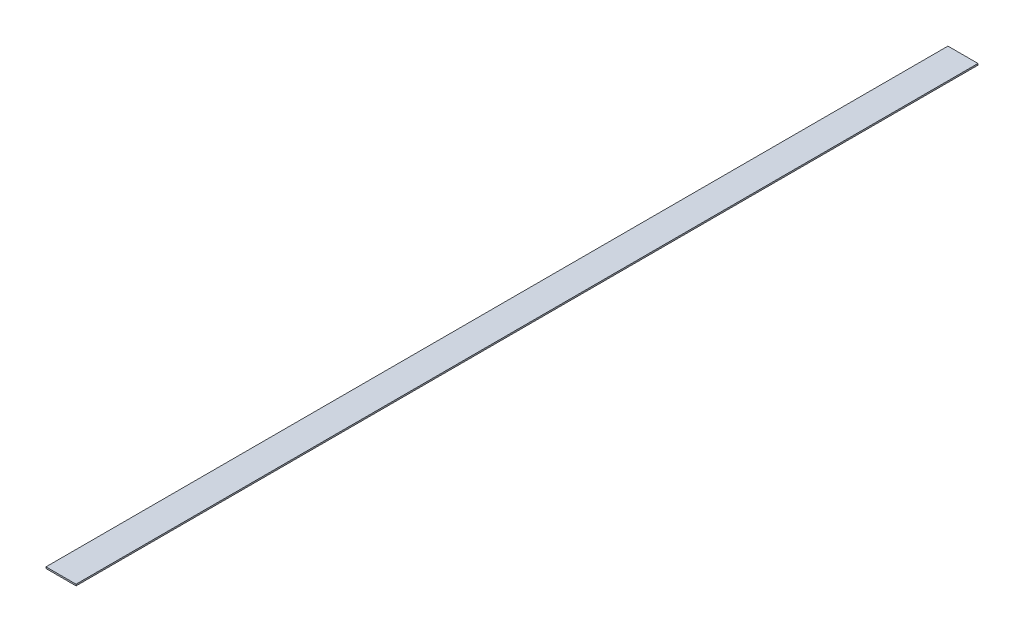
ISO-10303-21;
HEADER;
FILE_DESCRIPTION(('STEP AP214'),'2;1');
FILE_NAME('part.step','',(''),(''),'','','');
FILE_SCHEMA(('AUTOMOTIVE_DESIGN { 1 0 10303 214 1 1 1 1 }'));
ENDSEC;
DATA;
#1=APPLICATION_CONTEXT('core data for automotive mechanical design processes');
#2=APPLICATION_PROTOCOL_DEFINITION('international standard','automotive_design',2000,#1);
#3=PRODUCT_CONTEXT('',#1,'mechanical');
#4=PRODUCT('Part','Part','',(#3));
#5=PRODUCT_RELATED_PRODUCT_CATEGORY('part','',(#4));
#6=PRODUCT_DEFINITION_FORMATION('','',#4);
#7=PRODUCT_DEFINITION_CONTEXT('part definition',#1,'design');
#8=PRODUCT_DEFINITION('design','',#6,#7);
#9=PRODUCT_DEFINITION_SHAPE('','',#8);
#10=(LENGTH_UNIT() NAMED_UNIT(*) SI_UNIT(.MILLI.,.METRE.));
#11=(NAMED_UNIT(*) PLANE_ANGLE_UNIT() SI_UNIT($,.RADIAN.));
#12=(NAMED_UNIT(*) SI_UNIT($,.STERADIAN.) SOLID_ANGLE_UNIT());
#13=UNCERTAINTY_MEASURE_WITH_UNIT(LENGTH_MEASURE(1.E-05),#10,'distance_accuracy_value','');
#14=(GEOMETRIC_REPRESENTATION_CONTEXT(3) GLOBAL_UNCERTAINTY_ASSIGNED_CONTEXT((#13)) GLOBAL_UNIT_ASSIGNED_CONTEXT((#10,
#11,#12)) REPRESENTATION_CONTEXT('',''));
#15=CARTESIAN_POINT('',(0.,0.,0.));
#16=DIRECTION('',(0.,0.,1.));
#17=DIRECTION('',(1.,0.,0.));
#18=AXIS2_PLACEMENT_3D('',#15,#16,#17);
#19=CARTESIAN_POINT('',(1.99999999999999,0.2,-60.));
#20=DIRECTION('',(-1.,0.,0.));
#21=DIRECTION('',(0.,0.,1.));
#22=AXIS2_PLACEMENT_3D('',#19,#20,#21);
#23=PLANE('',#22);
#24=DIRECTION('',(0.,0.,-1.));
#25=VECTOR('',#24,1.);
#26=CARTESIAN_POINT('',(1.99999999999999,0.,-60.));
#27=LINE('',#26,#25);
#28=CARTESIAN_POINT('',(2.00000000000001,0.,60.));
#29=VERTEX_POINT('',#28);
#30=CARTESIAN_POINT('',(1.99999999999999,0.,-60.));
#31=VERTEX_POINT('',#30);
#32=EDGE_CURVE('E99',#29,#31,#27,.T.);
#33=ORIENTED_EDGE('',*,*,#32,.T.);
#34=DIRECTION('',(0.,-1.,0.));
#35=VECTOR('',#34,1.);
#36=CARTESIAN_POINT('',(1.99999999999999,0.2,-60.));
#37=LINE('',#36,#35);
#38=CARTESIAN_POINT('',(1.99999999999999,0.2,-60.));
#39=VERTEX_POINT('',#38);
#40=EDGE_CURVE('E11',#39,#31,#37,.T.);
#41=ORIENTED_EDGE('',*,*,#40,.F.);
#42=DIRECTION('',(0.,0.,-1.));
#43=VECTOR('',#42,1.);
#44=CARTESIAN_POINT('',(1.99999999999999,0.2,-60.));
#45=LINE('',#44,#43);
#46=CARTESIAN_POINT('',(2.00000000000001,0.2,60.));
#47=VERTEX_POINT('',#46);
#48=EDGE_CURVE('E87',#47,#39,#45,.T.);
#49=ORIENTED_EDGE('',*,*,#48,.F.);
#50=DIRECTION('',(0.,-1.,0.));
#51=VECTOR('',#50,1.);
#52=CARTESIAN_POINT('',(2.00000000000001,0.2,60.));
#53=LINE('',#52,#51);
#54=EDGE_CURVE('E95',#47,#29,#53,.T.);
#55=ORIENTED_EDGE('',*,*,#54,.T.);
#56=EDGE_LOOP('',(#33,#41,#49,#55));
#57=FACE_BOUND('',#56,.T.);
#58=ADVANCED_FACE('F36',(#57),#23,.F.);
#59=CARTESIAN_POINT('',(-2.00000000000001,0.2,-60.));
#60=DIRECTION('',(0.,0.,1.));
#61=DIRECTION('',(1.,0.,0.));
#62=AXIS2_PLACEMENT_3D('',#59,#60,#61);
#63=PLANE('',#62);
#64=DIRECTION('',(-1.,0.,0.));
#65=VECTOR('',#64,1.);
#66=CARTESIAN_POINT('',(-2.00000000000001,0.,-60.));
#67=LINE('',#66,#65);
#68=CARTESIAN_POINT('',(-2.00000000000001,0.,-60.));
#69=VERTEX_POINT('',#68);
#70=EDGE_CURVE('E91',#31,#69,#67,.T.);
#71=ORIENTED_EDGE('',*,*,#70,.T.);
#72=DIRECTION('',(0.,-1.,0.));
#73=VECTOR('',#72,1.);
#74=CARTESIAN_POINT('',(-2.00000000000001,0.2,-60.));
#75=LINE('',#74,#73);
#76=CARTESIAN_POINT('',(-2.00000000000001,0.2,-60.));
#77=VERTEX_POINT('',#76);
#78=EDGE_CURVE('E44',#77,#69,#75,.T.);
#79=ORIENTED_EDGE('',*,*,#78,.F.);
#80=DIRECTION('',(-1.,0.,0.));
#81=VECTOR('',#80,1.);
#82=CARTESIAN_POINT('',(-2.00000000000001,0.2,-60.));
#83=LINE('',#82,#81);
#84=EDGE_CURVE('E82',#39,#77,#83,.T.);
#85=ORIENTED_EDGE('',*,*,#84,.F.);
#86=ORIENTED_EDGE('',*,*,#40,.T.);
#87=EDGE_LOOP('',(#71,#79,#85,#86));
#88=FACE_BOUND('',#87,.T.);
#89=ADVANCED_FACE('F90',(#88),#63,.F.);
#90=CARTESIAN_POINT('',(-2.00000000000001,0.2,-60.));
#91=DIRECTION('',(1.,0.,0.));
#92=DIRECTION('',(0.,0.,-1.));
#93=AXIS2_PLACEMENT_3D('',#90,#91,#92);
#94=PLANE('',#93);
#95=DIRECTION('',(0.,0.,1.));
#96=VECTOR('',#95,1.);
#97=CARTESIAN_POINT('',(-2.00000000000001,0.,-60.));
#98=LINE('',#97,#96);
#99=CARTESIAN_POINT('',(-1.99999999999999,0.,60.));
#100=VERTEX_POINT('',#99);
#101=EDGE_CURVE('E69',#69,#100,#98,.T.);
#102=ORIENTED_EDGE('',*,*,#101,.T.);
#103=DIRECTION('',(0.,-1.,0.));
#104=VECTOR('',#103,1.);
#105=CARTESIAN_POINT('',(-1.99999999999999,0.2,60.));
#106=LINE('',#105,#104);
#107=CARTESIAN_POINT('',(-1.99999999999999,0.2,60.));
#108=VERTEX_POINT('',#107);
#109=EDGE_CURVE('E92',#108,#100,#106,.T.);
#110=ORIENTED_EDGE('',*,*,#109,.F.);
#111=DIRECTION('',(0.,0.,1.));
#112=VECTOR('',#111,1.);
#113=CARTESIAN_POINT('',(-2.00000000000001,0.2,-60.));
#114=LINE('',#113,#112);
#115=EDGE_CURVE('E85',#77,#108,#114,.T.);
#116=ORIENTED_EDGE('',*,*,#115,.F.);
#117=ORIENTED_EDGE('',*,*,#78,.T.);
#118=EDGE_LOOP('',(#102,#110,#116,#117));
#119=FACE_BOUND('',#118,.T.);
#120=ADVANCED_FACE('F93',(#119),#94,.F.);
#121=CARTESIAN_POINT('',(-1.99999999999999,0.2,60.));
#122=DIRECTION('',(0.,0.,-1.));
#123=DIRECTION('',(-1.,0.,0.));
#124=AXIS2_PLACEMENT_3D('',#121,#122,#123);
#125=PLANE('',#124);
#126=DIRECTION('',(1.,0.,0.));
#127=VECTOR('',#126,1.);
#128=CARTESIAN_POINT('',(-1.99999999999999,0.,60.));
#129=LINE('',#128,#127);
#130=EDGE_CURVE('E75',#100,#29,#129,.T.);
#131=ORIENTED_EDGE('',*,*,#130,.T.);
#132=ORIENTED_EDGE('',*,*,#54,.F.);
#133=DIRECTION('',(1.,0.,0.));
#134=VECTOR('',#133,1.);
#135=CARTESIAN_POINT('',(-1.99999999999999,0.2,60.));
#136=LINE('',#135,#134);
#137=EDGE_CURVE('E52',#108,#47,#136,.T.);
#138=ORIENTED_EDGE('',*,*,#137,.F.);
#139=ORIENTED_EDGE('',*,*,#109,.T.);
#140=EDGE_LOOP('',(#131,#132,#138,#139));
#141=FACE_BOUND('',#140,.T.);
#142=ADVANCED_FACE('F106',(#141),#125,.F.);
#143=CARTESIAN_POINT('',(0.,0.2,0.));
#144=DIRECTION('',(0.,1.,0.));
#145=DIRECTION('',(0.,0.,1.));
#146=AXIS2_PLACEMENT_3D('',#143,#144,#145);
#147=PLANE('',#146);
#148=ORIENTED_EDGE('',*,*,#48,.T.);
#149=ORIENTED_EDGE('',*,*,#84,.T.);
#150=ORIENTED_EDGE('',*,*,#115,.T.);
#151=ORIENTED_EDGE('',*,*,#137,.T.);
#152=EDGE_LOOP('',(#148,#149,#150,#151));
#153=FACE_BOUND('',#152,.T.);
#154=ADVANCED_FACE('F83',(#153),#147,.T.);
#155=CARTESIAN_POINT('',(0.,0.,0.));
#156=DIRECTION('',(0.,1.,0.));
#157=DIRECTION('',(0.,0.,1.));
#158=AXIS2_PLACEMENT_3D('',#155,#156,#157);
#159=PLANE('',#158);
#160=ORIENTED_EDGE('',*,*,#32,.F.);
#161=ORIENTED_EDGE('',*,*,#130,.F.);
#162=ORIENTED_EDGE('',*,*,#101,.F.);
#163=ORIENTED_EDGE('',*,*,#70,.F.);
#164=EDGE_LOOP('',(#160,#161,#162,#163));
#165=FACE_BOUND('',#164,.T.);
#166=ADVANCED_FACE('F109',(#165),#159,.F.);
#167=CLOSED_SHELL('',(#58,#89,#120,#142,#154,#166));
#168=MANIFOLD_SOLID_BREP('B2',#167);
#169=ADVANCED_BREP_SHAPE_REPRESENTATION('',(#18,#168),#14);
#170=SHAPE_DEFINITION_REPRESENTATION(#9,#169);
ENDSEC;
END-ISO-10303-21;
